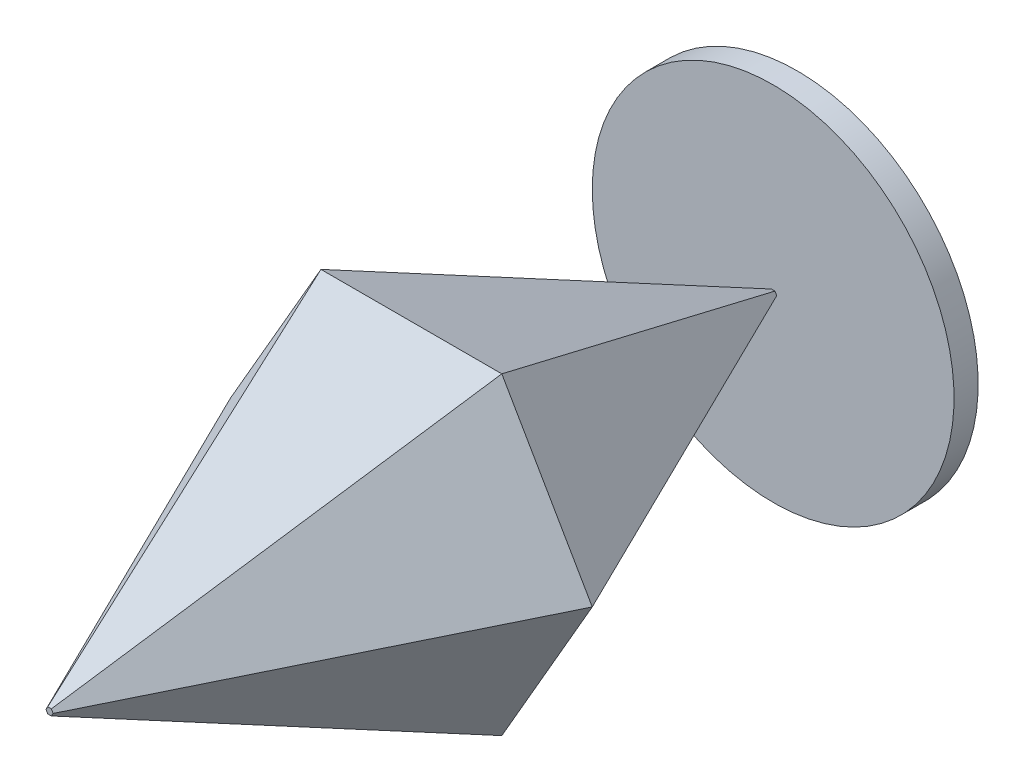
ISO-10303-21;
HEADER;
FILE_DESCRIPTION(('STEP AP214'),'2;1');
FILE_NAME('part.step','',(''),(''),'','','');
FILE_SCHEMA(('AUTOMOTIVE_DESIGN { 1 0 10303 214 1 1 1 1 }'));
ENDSEC;
DATA;
#1=APPLICATION_CONTEXT('core data for automotive mechanical design processes');
#2=APPLICATION_PROTOCOL_DEFINITION('international standard','automotive_design',2000,#1);
#3=PRODUCT_CONTEXT('',#1,'mechanical');
#4=PRODUCT('Part','Part','',(#3));
#5=PRODUCT_RELATED_PRODUCT_CATEGORY('part','',(#4));
#6=PRODUCT_DEFINITION_FORMATION('','',#4);
#7=PRODUCT_DEFINITION_CONTEXT('part definition',#1,'design');
#8=PRODUCT_DEFINITION('design','',#6,#7);
#9=PRODUCT_DEFINITION_SHAPE('','',#8);
#10=(LENGTH_UNIT() NAMED_UNIT(*) SI_UNIT(.MILLI.,.METRE.));
#11=(NAMED_UNIT(*) PLANE_ANGLE_UNIT() SI_UNIT($,.RADIAN.));
#12=(NAMED_UNIT(*) SI_UNIT($,.STERADIAN.) SOLID_ANGLE_UNIT());
#13=UNCERTAINTY_MEASURE_WITH_UNIT(LENGTH_MEASURE(1.E-05),#10,'distance_accuracy_value','');
#14=(GEOMETRIC_REPRESENTATION_CONTEXT(3) GLOBAL_UNCERTAINTY_ASSIGNED_CONTEXT((#13)) GLOBAL_UNIT_ASSIGNED_CONTEXT((#10,
#11,#12)) REPRESENTATION_CONTEXT('',''));
#15=CARTESIAN_POINT('',(0.,0.,0.));
#16=DIRECTION('',(0.,0.,1.));
#17=DIRECTION('',(1.,0.,0.));
#18=AXIS2_PLACEMENT_3D('',#15,#16,#17);
#19=CARTESIAN_POINT('',(7.50000000000015,-12.9903810567665,0.));
#20=DIRECTION('',(0.797180587396688,-0.460252426726215,0.390731128489274));
#21=DIRECTION('',(0.499999999999995,0.866025403784442,0.));
#22=AXIS2_PLACEMENT_3D('',#19,#20,#21);
#23=PLANE('',#22);
#24=DIRECTION('',(0.499999999999995,0.866025403784442,0.));
#25=VECTOR('',#24,1.);
#26=CARTESIAN_POINT('',(7.50000000000015,-12.9903810567665,0.));
#27=LINE('',#26,#25);
#28=CARTESIAN_POINT('',(7.50000000000015,-12.9903810567665,0.));
#29=VERTEX_POINT('',#28);
#30=CARTESIAN_POINT('',(15.,0.,0.));
#31=VERTEX_POINT('',#30);
#32=EDGE_CURVE('E147',#29,#31,#27,.T.);
#33=ORIENTED_EDGE('',*,*,#32,.T.);
#34=DIRECTION('',(0.440117557530944,0.,-0.897940162568195));
#35=VECTOR('',#34,1.);
#36=CARTESIAN_POINT('',(15.,0.,0.));
#37=LINE('',#36,#35);
#38=CARTESIAN_POINT('',(0.295761035830084,0.,30.));
#39=VERTEX_POINT('',#38);
#40=EDGE_CURVE('E11',#39,#31,#37,.T.);
#41=ORIENTED_EDGE('',*,*,#40,.F.);
#42=DIRECTION('',(-0.499999999999995,-0.866025403784442,0.));
#43=VECTOR('',#42,1.);
#44=CARTESIAN_POINT('',(-3.52817922312734,-6.62325881362248,30.));
#45=LINE('',#44,#43);
#46=CARTESIAN_POINT('',(0.147880517915091,-0.25613657047842,30.));
#47=VERTEX_POINT('',#46);
#48=EDGE_CURVE('E162',#47,#39,#45,.F.);
#49=ORIENTED_EDGE('',*,*,#48,.F.);
#50=DIRECTION('',(0.220058778765475,-0.381152985473355,-0.897940162568195));
#51=VECTOR('',#50,1.);
#52=CARTESIAN_POINT('',(7.50000000000015,-12.9903810567665,0.));
#53=LINE('',#52,#51);
#54=EDGE_CURVE('E164',#47,#29,#53,.T.);
#55=ORIENTED_EDGE('',*,*,#54,.T.);
#56=EDGE_LOOP('',(#33,#41,#49,#55));
#57=FACE_BOUND('',#56,.T.);
#58=ADVANCED_FACE('F33',(#57),#23,.T.);
#59=CARTESIAN_POINT('',(15.,0.,0.));
#60=DIRECTION('',(0.797180587396685,0.460252426726221,0.390731128489274));
#61=DIRECTION('',(-0.500000000000001,0.866025403784438,0.));
#62=AXIS2_PLACEMENT_3D('',#59,#60,#61);
#63=PLANE('',#62);
#64=DIRECTION('',(-0.500000000000001,0.866025403784438,0.));
#65=VECTOR('',#64,1.);
#66=CARTESIAN_POINT('',(15.,0.,0.));
#67=LINE('',#66,#65);
#68=CARTESIAN_POINT('',(7.49999999999997,12.9903810567666,0.));
#69=VERTEX_POINT('',#68);
#70=EDGE_CURVE('E121',#31,#69,#67,.T.);
#71=ORIENTED_EDGE('',*,*,#70,.T.);
#72=DIRECTION('',(0.220058778765471,0.381152985473358,-0.897940162568194));
#73=VECTOR('',#72,1.);
#74=CARTESIAN_POINT('',(7.49999999999997,12.9903810567666,0.));
#75=LINE('',#74,#73);
#76=CARTESIAN_POINT('',(0.147880517915027,0.256136570478422,30.));
#77=VERTEX_POINT('',#76);
#78=EDGE_CURVE('E42',#77,#69,#75,.T.);
#79=ORIENTED_EDGE('',*,*,#78,.F.);
#80=DIRECTION('',(0.500000000000001,-0.866025403784438,0.));
#81=VECTOR('',#80,1.);
#82=CARTESIAN_POINT('',(3.97182077687255,-6.36712224314409,30.));
#83=LINE('',#82,#81);
#84=EDGE_CURVE('E179',#39,#77,#83,.F.);
#85=ORIENTED_EDGE('',*,*,#84,.F.);
#86=ORIENTED_EDGE('',*,*,#40,.T.);
#87=EDGE_LOOP('',(#71,#79,#85,#86));
#88=FACE_BOUND('',#87,.T.);
#89=ADVANCED_FACE('F35',(#88),#63,.T.);
#90=CARTESIAN_POINT('',(7.49999999999997,12.9903810567666,0.));
#91=DIRECTION('',(0.,0.92050485345244,0.390731128489274));
#92=DIRECTION('',(0.,-0.390731128489274,0.92050485345244));
#93=AXIS2_PLACEMENT_3D('',#90,#91,#92);
#94=PLANE('',#93);
#95=DIRECTION('',(-1.,0.,0.));
#96=VECTOR('',#95,1.);
#97=CARTESIAN_POINT('',(7.49999999999997,12.9903810567666,0.));
#98=LINE('',#97,#96);
#99=CARTESIAN_POINT('',(-7.50000000000006,12.9903810567665,0.));
#100=VERTEX_POINT('',#99);
#101=EDGE_CURVE('E151',#69,#100,#98,.T.);
#102=ORIENTED_EDGE('',*,*,#101,.T.);
#103=DIRECTION('',(-0.220058778765474,0.381152985473356,-0.897940162568194));
#104=VECTOR('',#103,1.);
#105=CARTESIAN_POINT('',(-7.50000000000006,12.9903810567665,0.));
#106=LINE('',#105,#104);
#107=CARTESIAN_POINT('',(-0.147880517915028,0.25613657047842,30.));
#108=VERTEX_POINT('',#107);
#109=EDGE_CURVE('E173',#108,#100,#106,.T.);
#110=ORIENTED_EDGE('',*,*,#109,.F.);
#111=DIRECTION('',(1.,0.,0.));
#112=VECTOR('',#111,1.);
#113=CARTESIAN_POINT('',(7.50000000000002,0.25613657047845,30.));
#114=LINE('',#113,#112);
#115=EDGE_CURVE('E181',#77,#108,#114,.F.);
#116=ORIENTED_EDGE('',*,*,#115,.F.);
#117=ORIENTED_EDGE('',*,*,#78,.T.);
#118=EDGE_LOOP('',(#102,#110,#116,#117));
#119=FACE_BOUND('',#118,.T.);
#120=ADVANCED_FACE('F204',(#119),#94,.T.);
#121=CARTESIAN_POINT('',(-7.50000000000006,12.9903810567665,0.));
#122=DIRECTION('',(-0.797180587396688,0.460252426726216,0.390731128489274));
#123=DIRECTION('',(-0.499999999999995,-0.866025403784441,0.));
#124=AXIS2_PLACEMENT_3D('',#121,#122,#123);
#125=PLANE('',#124);
#126=DIRECTION('',(-0.499999999999995,-0.866025403784442,0.));
#127=VECTOR('',#126,1.);
#128=CARTESIAN_POINT('',(-7.50000000000006,12.9903810567665,0.));
#129=LINE('',#128,#127);
#130=CARTESIAN_POINT('',(-15.,-1.04744440165294E-13,0.));
#131=VERTEX_POINT('',#130);
#132=EDGE_CURVE('E154',#100,#131,#129,.T.);
#133=ORIENTED_EDGE('',*,*,#132,.T.);
#134=DIRECTION('',(-0.440117557530945,0.,-0.897940162568195));
#135=VECTOR('',#134,1.);
#136=CARTESIAN_POINT('',(-15.,-1.04744440165294E-13,0.));
#137=LINE('',#136,#135);
#138=CARTESIAN_POINT('',(-0.295761035830049,0.,30.));
#139=VERTEX_POINT('',#138);
#140=EDGE_CURVE('E170',#139,#131,#137,.T.);
#141=ORIENTED_EDGE('',*,*,#140,.F.);
#142=DIRECTION('',(0.499999999999995,0.866025403784441,0.));
#143=VECTOR('',#142,1.);
#144=CARTESIAN_POINT('',(3.52817922312743,6.62325881362253,30.));
#145=LINE('',#144,#143);
#146=EDGE_CURVE('E183',#108,#139,#145,.F.);
#147=ORIENTED_EDGE('',*,*,#146,.F.);
#148=ORIENTED_EDGE('',*,*,#109,.T.);
#149=EDGE_LOOP('',(#133,#141,#147,#148));
#150=FACE_BOUND('',#149,.T.);
#151=ADVANCED_FACE('F190',(#150),#125,.T.);
#152=CARTESIAN_POINT('',(-15.,-1.04744440165294E-13,0.));
#153=DIRECTION('',(-0.797180587396681,-0.460252426726227,0.390731128489274));
#154=DIRECTION('',(0.500000000000007,-0.866025403784435,0.));
#155=AXIS2_PLACEMENT_3D('',#152,#153,#154);
#156=PLANE('',#155);
#157=DIRECTION('',(0.500000000000007,-0.866025403784435,0.));
#158=VECTOR('',#157,1.);
#159=CARTESIAN_POINT('',(-15.,-1.04744440165294E-13,0.));
#160=LINE('',#159,#158);
#161=CARTESIAN_POINT('',(-7.49999999999988,-12.9903810567666,0.));
#162=VERTEX_POINT('',#161);
#163=EDGE_CURVE('E157',#131,#162,#160,.T.);
#164=ORIENTED_EDGE('',*,*,#163,.T.);
#165=DIRECTION('',(-0.220058778765469,-0.381152985473359,-0.897940162568194));
#166=VECTOR('',#165,1.);
#167=CARTESIAN_POINT('',(-7.49999999999988,-12.9903810567666,0.));
#168=LINE('',#167,#166);
#169=CARTESIAN_POINT('',(-0.147880517915024,-0.256136570478422,30.));
#170=VERTEX_POINT('',#169);
#171=EDGE_CURVE('E167',#170,#162,#168,.T.);
#172=ORIENTED_EDGE('',*,*,#171,.F.);
#173=DIRECTION('',(-0.500000000000007,0.866025403784435,0.));
#174=VECTOR('',#173,1.);
#175=CARTESIAN_POINT('',(-3.9718207768726,6.36712224314406,30.));
#176=LINE('',#175,#174);
#177=EDGE_CURVE('E54',#139,#170,#176,.F.);
#178=ORIENTED_EDGE('',*,*,#177,.F.);
#179=ORIENTED_EDGE('',*,*,#140,.T.);
#180=EDGE_LOOP('',(#164,#172,#178,#179));
#181=FACE_BOUND('',#180,.T.);
#182=ADVANCED_FACE('F193',(#181),#156,.T.);
#183=CARTESIAN_POINT('',(-7.49999999999988,-12.9903810567666,0.));
#184=DIRECTION('',(0.,-0.92050485345244,0.390731128489274));
#185=DIRECTION('',(0.,-0.390731128489274,-0.92050485345244));
#186=AXIS2_PLACEMENT_3D('',#183,#184,#185);
#187=PLANE('',#186);
#188=DIRECTION('',(1.,0.,0.));
#189=VECTOR('',#188,1.);
#190=CARTESIAN_POINT('',(-7.49999999999988,-12.9903810567666,0.));
#191=LINE('',#190,#189);
#192=EDGE_CURVE('E160',#162,#29,#191,.T.);
#193=ORIENTED_EDGE('',*,*,#192,.T.);
#194=ORIENTED_EDGE('',*,*,#54,.F.);
#195=DIRECTION('',(-1.,0.,0.));
#196=VECTOR('',#195,1.);
#197=CARTESIAN_POINT('',(-7.50000000000001,-0.2561365704785,30.));
#198=LINE('',#197,#196);
#199=EDGE_CURVE('E37',#170,#47,#198,.F.);
#200=ORIENTED_EDGE('',*,*,#199,.F.);
#201=ORIENTED_EDGE('',*,*,#171,.T.);
#202=EDGE_LOOP('',(#193,#194,#200,#201));
#203=FACE_BOUND('',#202,.T.);
#204=ADVANCED_FACE('F196',(#203),#187,.T.);
#205=CARTESIAN_POINT('',(0.,0.,30.));
#206=DIRECTION('',(0.,0.,1.));
#207=DIRECTION('',(1.,0.,0.));
#208=AXIS2_PLACEMENT_3D('',#205,#206,#207);
#209=PLANE('',#208);
#210=ORIENTED_EDGE('',*,*,#48,.T.);
#211=ORIENTED_EDGE('',*,*,#84,.T.);
#212=ORIENTED_EDGE('',*,*,#115,.T.);
#213=ORIENTED_EDGE('',*,*,#146,.T.);
#214=ORIENTED_EDGE('',*,*,#177,.T.);
#215=ORIENTED_EDGE('',*,*,#199,.T.);
#216=EDGE_LOOP('',(#210,#211,#212,#213,#214,#215));
#217=FACE_BOUND('',#216,.T.);
#218=ADVANCED_FACE('F186',(#217),#209,.T.);
#219=CARTESIAN_POINT('',(7.50000000000015,-12.9903810567665,0.));
#220=DIRECTION('',(0.797180587396688,-0.460252426726215,-0.390731128489274));
#221=DIRECTION('',(0.499999999999995,0.866025403784442,0.));
#222=AXIS2_PLACEMENT_3D('',#219,#220,#221);
#223=PLANE('',#222);
#224=ORIENTED_EDGE('',*,*,#32,.F.);
#225=DIRECTION('',(0.220058778765475,-0.381152985473355,0.897940162568195));
#226=VECTOR('',#225,1.);
#227=CARTESIAN_POINT('',(6.77361200832388,-11.7322401491753,-2.96399423368839));
#228=LINE('',#227,#226);
#229=CARTESIAN_POINT('',(0.147880517915091,-0.25613657047842,-30.));
#230=VERTEX_POINT('',#229);
#231=EDGE_CURVE('E127',#230,#29,#228,.T.);
#232=ORIENTED_EDGE('',*,*,#231,.F.);
#233=DIRECTION('',(0.499999999999995,0.866025403784442,0.));
#234=VECTOR('',#233,1.);
#235=CARTESIAN_POINT('',(-3.52817922312734,-6.62325881362248,-30.));
#236=LINE('',#235,#234);
#237=CARTESIAN_POINT('',(0.295761035830084,0.,-30.));
#238=VERTEX_POINT('',#237);
#239=EDGE_CURVE('E109',#230,#238,#236,.T.);
#240=ORIENTED_EDGE('',*,*,#239,.T.);
#241=DIRECTION('',(0.440117557530944,0.,0.897940162568195));
#242=VECTOR('',#241,1.);
#243=CARTESIAN_POINT('',(13.5472240166475,0.,-2.96399423368835));
#244=LINE('',#243,#242);
#245=EDGE_CURVE('E116',#238,#31,#244,.T.);
#246=ORIENTED_EDGE('',*,*,#245,.T.);
#247=EDGE_LOOP('',(#224,#232,#240,#246));
#248=FACE_BOUND('',#247,.T.);
#249=ADVANCED_FACE('F126',(#248),#223,.T.);
#250=CARTESIAN_POINT('',(-7.49999999999988,-12.9903810567666,0.));
#251=DIRECTION('',(0.,-0.92050485345244,-0.390731128489274));
#252=DIRECTION('',(0.,0.390731128489274,-0.92050485345244));
#253=AXIS2_PLACEMENT_3D('',#250,#251,#252);
#254=PLANE('',#253);
#255=ORIENTED_EDGE('',*,*,#192,.F.);
#256=DIRECTION('',(-0.220058778765469,-0.381152985473359,0.897940162568194));
#257=VECTOR('',#256,1.);
#258=CARTESIAN_POINT('',(-6.77361200832362,-11.7322401491754,-2.96399423368841));
#259=LINE('',#258,#257);
#260=CARTESIAN_POINT('',(-0.147880517915024,-0.256136570478422,-30.));
#261=VERTEX_POINT('',#260);
#262=EDGE_CURVE('E138',#261,#162,#259,.T.);
#263=ORIENTED_EDGE('',*,*,#262,.F.);
#264=DIRECTION('',(1.,0.,0.));
#265=VECTOR('',#264,1.);
#266=CARTESIAN_POINT('',(-7.50000000000001,-0.2561365704785,-30.));
#267=LINE('',#266,#265);
#268=EDGE_CURVE('E129',#261,#230,#267,.T.);
#269=ORIENTED_EDGE('',*,*,#268,.T.);
#270=ORIENTED_EDGE('',*,*,#231,.T.);
#271=EDGE_LOOP('',(#255,#263,#269,#270));
#272=FACE_BOUND('',#271,.T.);
#273=ADVANCED_FACE('F274',(#272),#254,.T.);
#274=CARTESIAN_POINT('',(-15.,-1.04744440165294E-13,0.));
#275=DIRECTION('',(-0.797180587396681,-0.460252426726227,-0.390731128489274));
#276=DIRECTION('',(0.500000000000007,-0.866025403784435,0.));
#277=AXIS2_PLACEMENT_3D('',#274,#275,#276);
#278=PLANE('',#277);
#279=ORIENTED_EDGE('',*,*,#163,.F.);
#280=DIRECTION('',(-0.440117557530945,0.,0.897940162568195));
#281=VECTOR('',#280,1.);
#282=CARTESIAN_POINT('',(-13.5472240166475,0.,-2.96399423368841));
#283=LINE('',#282,#281);
#284=CARTESIAN_POINT('',(-0.295761035830049,0.,-30.));
#285=VERTEX_POINT('',#284);
#286=EDGE_CURVE('E210',#285,#131,#283,.T.);
#287=ORIENTED_EDGE('',*,*,#286,.F.);
#288=DIRECTION('',(0.500000000000007,-0.866025403784435,0.));
#289=VECTOR('',#288,1.);
#290=CARTESIAN_POINT('',(-3.9718207768726,6.36712224314406,-30.));
#291=LINE('',#290,#289);
#292=EDGE_CURVE('E132',#285,#261,#291,.T.);
#293=ORIENTED_EDGE('',*,*,#292,.T.);
#294=ORIENTED_EDGE('',*,*,#262,.T.);
#295=EDGE_LOOP('',(#279,#287,#293,#294));
#296=FACE_BOUND('',#295,.T.);
#297=ADVANCED_FACE('F283',(#296),#278,.T.);
#298=CARTESIAN_POINT('',(-7.50000000000006,12.9903810567665,0.));
#299=DIRECTION('',(-0.797180587396688,0.460252426726216,-0.390731128489274));
#300=DIRECTION('',(-0.499999999999995,-0.866025403784441,0.));
#301=AXIS2_PLACEMENT_3D('',#298,#299,#300);
#302=PLANE('',#301);
#303=ORIENTED_EDGE('',*,*,#132,.F.);
#304=DIRECTION('',(-0.220058778765474,0.381152985473356,0.897940162568194));
#305=VECTOR('',#304,1.);
#306=CARTESIAN_POINT('',(-6.77361200832378,11.7322401491753,-2.96399423368841));
#307=LINE('',#306,#305);
#308=CARTESIAN_POINT('',(-0.147880517915028,0.25613657047842,-30.));
#309=VERTEX_POINT('',#308);
#310=EDGE_CURVE('E208',#309,#100,#307,.T.);
#311=ORIENTED_EDGE('',*,*,#310,.F.);
#312=DIRECTION('',(-0.499999999999995,-0.866025403784441,0.));
#313=VECTOR('',#312,1.);
#314=CARTESIAN_POINT('',(3.52817922312743,6.62325881362253,-30.));
#315=LINE('',#314,#313);
#316=EDGE_CURVE('E143',#309,#285,#315,.T.);
#317=ORIENTED_EDGE('',*,*,#316,.T.);
#318=ORIENTED_EDGE('',*,*,#286,.T.);
#319=EDGE_LOOP('',(#303,#311,#317,#318));
#320=FACE_BOUND('',#319,.T.);
#321=ADVANCED_FACE('F291',(#320),#302,.T.);
#322=CARTESIAN_POINT('',(7.49999999999997,12.9903810567666,0.));
#323=DIRECTION('',(0.,0.92050485345244,-0.390731128489274));
#324=DIRECTION('',(0.,0.390731128489274,0.92050485345244));
#325=AXIS2_PLACEMENT_3D('',#322,#323,#324);
#326=PLANE('',#325);
#327=ORIENTED_EDGE('',*,*,#101,.F.);
#328=DIRECTION('',(0.220058778765471,0.381152985473358,0.897940162568194));
#329=VECTOR('',#328,1.);
#330=CARTESIAN_POINT('',(6.77361200832371,11.7322401491754,-2.96399423368841));
#331=LINE('',#330,#329);
#332=CARTESIAN_POINT('',(0.147880517915027,0.256136570478422,-30.));
#333=VERTEX_POINT('',#332);
#334=EDGE_CURVE('E124',#333,#69,#331,.T.);
#335=ORIENTED_EDGE('',*,*,#334,.F.);
#336=DIRECTION('',(-1.,0.,0.));
#337=VECTOR('',#336,1.);
#338=CARTESIAN_POINT('',(7.50000000000002,0.25613657047845,-30.));
#339=LINE('',#338,#337);
#340=EDGE_CURVE('E112',#333,#309,#339,.T.);
#341=ORIENTED_EDGE('',*,*,#340,.T.);
#342=ORIENTED_EDGE('',*,*,#310,.T.);
#343=EDGE_LOOP('',(#327,#335,#341,#342));
#344=FACE_BOUND('',#343,.T.);
#345=ADVANCED_FACE('F206',(#344),#326,.T.);
#346=CARTESIAN_POINT('',(15.,0.,0.));
#347=DIRECTION('',(0.797180587396685,0.460252426726221,-0.390731128489274));
#348=DIRECTION('',(-0.500000000000001,0.866025403784438,0.));
#349=AXIS2_PLACEMENT_3D('',#346,#347,#348);
#350=PLANE('',#349);
#351=ORIENTED_EDGE('',*,*,#70,.F.);
#352=ORIENTED_EDGE('',*,*,#245,.F.);
#353=DIRECTION('',(-0.500000000000001,0.866025403784438,0.));
#354=VECTOR('',#353,1.);
#355=CARTESIAN_POINT('',(3.97182077687255,-6.36712224314409,-30.));
#356=LINE('',#355,#354);
#357=EDGE_CURVE('E104',#238,#333,#356,.T.);
#358=ORIENTED_EDGE('',*,*,#357,.T.);
#359=ORIENTED_EDGE('',*,*,#334,.T.);
#360=EDGE_LOOP('',(#351,#352,#358,#359));
#361=FACE_BOUND('',#360,.T.);
#362=ADVANCED_FACE('F119',(#361),#350,.T.);
#363=CARTESIAN_POINT('',(0.,0.,-32.));
#364=DIRECTION('',(0.,0.,1.));
#365=DIRECTION('',(1.,0.,0.));
#366=AXIS2_PLACEMENT_3D('',#363,#364,#365);
#367=CYLINDRICAL_SURFACE('',#366,15.);
#368=CARTESIAN_POINT('',(0.,0.,-32.));
#369=DIRECTION('',(0.,0.,-1.));
#370=DIRECTION('',(-1.,0.,0.));
#371=AXIS2_PLACEMENT_3D('',#368,#369,#370);
#372=CIRCLE('',#371,15.);
#373=CARTESIAN_POINT('',(-15.,0.,-32.));
#374=VERTEX_POINT('',#373);
#375=EDGE_CURVE('E130',#374,#374,#372,.T.);
#376=ORIENTED_EDGE('',*,*,#375,.F.);
#377=EDGE_LOOP('',(#376));
#378=FACE_BOUND('',#377,.T.);
#379=CARTESIAN_POINT('',(0.,0.,-30.));
#380=DIRECTION('',(0.,0.,-1.));
#381=DIRECTION('',(-1.,0.,0.));
#382=AXIS2_PLACEMENT_3D('',#379,#380,#381);
#383=CIRCLE('',#382,15.);
#384=CARTESIAN_POINT('',(-15.,0.,-30.));
#385=VERTEX_POINT('',#384);
#386=EDGE_CURVE('E135',#385,#385,#383,.T.);
#387=ORIENTED_EDGE('',*,*,#386,.T.);
#388=EDGE_LOOP('',(#387));
#389=FACE_BOUND('',#388,.T.);
#390=ADVANCED_FACE('F222',(#378,#389),#367,.T.);
#391=CARTESIAN_POINT('',(0.,0.,-32.));
#392=DIRECTION('',(0.,0.,-1.));
#393=DIRECTION('',(-1.,0.,0.));
#394=AXIS2_PLACEMENT_3D('',#391,#392,#393);
#395=PLANE('',#394);
#396=ORIENTED_EDGE('',*,*,#375,.T.);
#397=EDGE_LOOP('',(#396));
#398=FACE_BOUND('',#397,.T.);
#399=ADVANCED_FACE('F224',(#398),#395,.T.);
#400=CARTESIAN_POINT('',(0.,0.,-30.));
#401=DIRECTION('',(0.,0.,-1.));
#402=DIRECTION('',(-1.,0.,0.));
#403=AXIS2_PLACEMENT_3D('',#400,#401,#402);
#404=PLANE('',#403);
#405=ORIENTED_EDGE('',*,*,#239,.F.);
#406=ORIENTED_EDGE('',*,*,#268,.F.);
#407=ORIENTED_EDGE('',*,*,#292,.F.);
#408=ORIENTED_EDGE('',*,*,#316,.F.);
#409=ORIENTED_EDGE('',*,*,#340,.F.);
#410=ORIENTED_EDGE('',*,*,#357,.F.);
#411=EDGE_LOOP('',(#405,#406,#407,#408,#409,#410));
#412=FACE_BOUND('',#411,.T.);
#413=ORIENTED_EDGE('',*,*,#386,.F.);
#414=EDGE_LOOP('',(#413));
#415=FACE_BOUND('',#414,.T.);
#416=ADVANCED_FACE('F106',(#412,#415),#404,.F.);
#417=CLOSED_SHELL('',(#58,#89,#120,#151,#182,#204,#218,#249,#273,#297,#321,#345,#362,#390,#399,#416));
#418=MANIFOLD_SOLID_BREP('B2',#417);
#419=ADVANCED_BREP_SHAPE_REPRESENTATION('',(#18,#418),#14);
#420=SHAPE_DEFINITION_REPRESENTATION(#9,#419);
ENDSEC;
END-ISO-10303-21;
